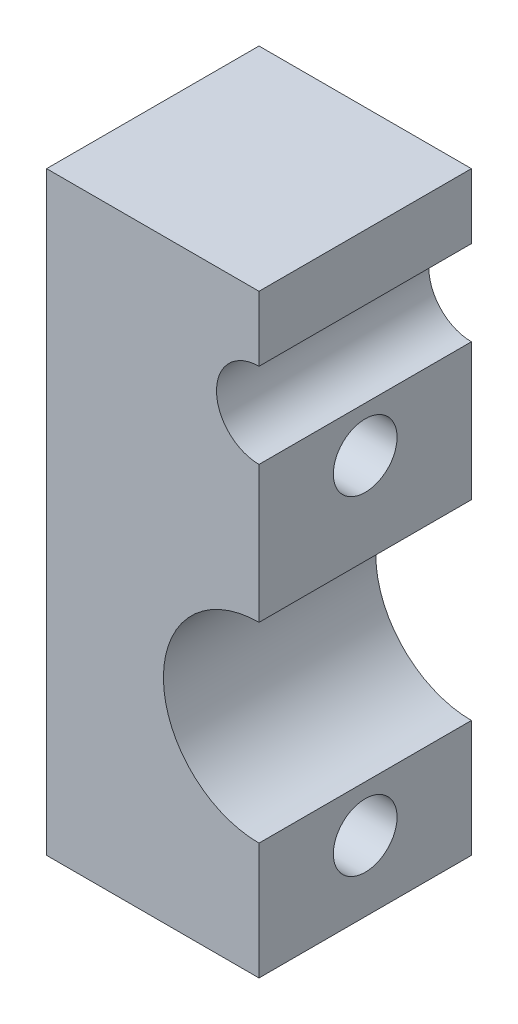
ISO-10303-21;
HEADER;
FILE_DESCRIPTION(('STEP AP214'),'2;1');
FILE_NAME('part.step','',(''),(''),'','','');
FILE_SCHEMA(('AUTOMOTIVE_DESIGN { 1 0 10303 214 1 1 1 1 }'));
ENDSEC;
DATA;
#1=APPLICATION_CONTEXT('core data for automotive mechanical design processes');
#2=APPLICATION_PROTOCOL_DEFINITION('international standard','automotive_design',2000,#1);
#3=PRODUCT_CONTEXT('',#1,'mechanical');
#4=PRODUCT('Part','Part','',(#3));
#5=PRODUCT_RELATED_PRODUCT_CATEGORY('part','',(#4));
#6=PRODUCT_DEFINITION_FORMATION('','',#4);
#7=PRODUCT_DEFINITION_CONTEXT('part definition',#1,'design');
#8=PRODUCT_DEFINITION('design','',#6,#7);
#9=PRODUCT_DEFINITION_SHAPE('','',#8);
#10=(LENGTH_UNIT() NAMED_UNIT(*) SI_UNIT(.MILLI.,.METRE.));
#11=(NAMED_UNIT(*) PLANE_ANGLE_UNIT() SI_UNIT($,.RADIAN.));
#12=(NAMED_UNIT(*) SI_UNIT($,.STERADIAN.) SOLID_ANGLE_UNIT());
#13=UNCERTAINTY_MEASURE_WITH_UNIT(LENGTH_MEASURE(1.E-05),#10,'distance_accuracy_value','');
#14=(GEOMETRIC_REPRESENTATION_CONTEXT(3) GLOBAL_UNCERTAINTY_ASSIGNED_CONTEXT((#13)) GLOBAL_UNIT_ASSIGNED_CONTEXT((#10,
#11,#12)) REPRESENTATION_CONTEXT('',''));
#15=CARTESIAN_POINT('',(0.,0.,0.));
#16=DIRECTION('',(0.,0.,1.));
#17=DIRECTION('',(1.,0.,0.));
#18=AXIS2_PLACEMENT_3D('',#15,#16,#17);
#19=CARTESIAN_POINT('',(5.,28.,-5.));
#20=DIRECTION('',(-1.,0.,0.));
#21=DIRECTION('',(0.,0.,1.));
#22=AXIS2_PLACEMENT_3D('',#19,#20,#21);
#23=PLANE('',#22);
#24=CARTESIAN_POINT('',(5.,18.7988960078297,0.));
#25=DIRECTION('',(1.,0.,0.));
#26=DIRECTION('',(0.,0.,-1.));
#27=AXIS2_PLACEMENT_3D('',#24,#25,#26);
#28=CIRCLE('',#27,1.5);
#29=CARTESIAN_POINT('',(5.,18.7988960078297,-1.5));
#30=VERTEX_POINT('',#29);
#31=EDGE_CURVE('E171',#30,#30,#28,.T.);
#32=ORIENTED_EDGE('',*,*,#31,.F.);
#33=EDGE_LOOP('',(#32));
#34=FACE_BOUND('',#33,.T.);
#35=DIRECTION('',(0.,-1.,0.));
#36=VECTOR('',#35,1.);
#37=CARTESIAN_POINT('',(5.,28.,-5.));
#38=LINE('',#37,#36);
#39=CARTESIAN_POINT('',(5.,20.9406561714239,-5.));
#40=VERTEX_POINT('',#39);
#41=CARTESIAN_POINT('',(5.,14.4999999964587,-5.));
#42=VERTEX_POINT('',#41);
#43=EDGE_CURVE('E41',#40,#42,#38,.T.);
#44=ORIENTED_EDGE('',*,*,#43,.F.);
#45=DIRECTION('',(0.,0.,1.));
#46=VECTOR('',#45,1.);
#47=CARTESIAN_POINT('',(5.,20.9406561714239,-5.));
#48=LINE('',#47,#46);
#49=CARTESIAN_POINT('',(5.,20.9406561714239,5.));
#50=VERTEX_POINT('',#49);
#51=EDGE_CURVE('E101',#40,#50,#48,.T.);
#52=ORIENTED_EDGE('',*,*,#51,.T.);
#53=DIRECTION('',(0.,-1.,0.));
#54=VECTOR('',#53,1.);
#55=CARTESIAN_POINT('',(5.,28.,5.));
#56=LINE('',#55,#54);
#57=CARTESIAN_POINT('',(5.,14.4999999964587,5.));
#58=VERTEX_POINT('',#57);
#59=EDGE_CURVE('E57',#50,#58,#56,.T.);
#60=ORIENTED_EDGE('',*,*,#59,.T.);
#61=DIRECTION('',(0.,0.,1.));
#62=VECTOR('',#61,1.);
#63=CARTESIAN_POINT('',(5.,14.4999999964587,-5.));
#64=LINE('',#63,#62);
#65=EDGE_CURVE('E157',#58,#42,#64,.F.);
#66=ORIENTED_EDGE('',*,*,#65,.T.);
#67=EDGE_LOOP('',(#44,#52,#60,#66));
#68=FACE_BOUND('',#67,.T.);
#69=ADVANCED_FACE('F33',(#34,#68),#23,.F.);
#70=CARTESIAN_POINT('',(5.,3.30969720228325,0.));
#71=DIRECTION('',(1.,0.,0.));
#72=DIRECTION('',(0.,0.,-1.));
#73=AXIS2_PLACEMENT_3D('',#70,#71,#72);
#74=CIRCLE('',#73,1.5);
#75=CARTESIAN_POINT('',(5.,3.30969720228325,-1.5));
#76=VERTEX_POINT('',#75);
#77=EDGE_CURVE('E165',#76,#76,#74,.T.);
#78=ORIENTED_EDGE('',*,*,#77,.F.);
#79=EDGE_LOOP('',(#78));
#80=FACE_BOUND('',#79,.T.);
#81=CARTESIAN_POINT('',(5.,5.50000000575559,-5.));
#82=VERTEX_POINT('',#81);
#83=CARTESIAN_POINT('',(5.,0.,-5.));
#84=VERTEX_POINT('',#83);
#85=EDGE_CURVE('E42',#82,#84,#38,.T.);
#86=ORIENTED_EDGE('',*,*,#85,.F.);
#87=DIRECTION('',(0.,0.,1.));
#88=VECTOR('',#87,1.);
#89=CARTESIAN_POINT('',(5.,5.50000000575559,-5.));
#90=LINE('',#89,#88);
#91=CARTESIAN_POINT('',(5.,5.50000000575559,5.));
#92=VERTEX_POINT('',#91);
#93=EDGE_CURVE('E133',#82,#92,#90,.T.);
#94=ORIENTED_EDGE('',*,*,#93,.T.);
#95=CARTESIAN_POINT('',(5.,0.,5.));
#96=VERTEX_POINT('',#95);
#97=EDGE_CURVE('E138',#92,#96,#56,.T.);
#98=ORIENTED_EDGE('',*,*,#97,.T.);
#99=DIRECTION('',(0.,0.,-1.));
#100=VECTOR('',#99,1.);
#101=CARTESIAN_POINT('',(5.,0.,-5.));
#102=LINE('',#101,#100);
#103=EDGE_CURVE('E139',#96,#84,#102,.T.);
#104=ORIENTED_EDGE('',*,*,#103,.T.);
#105=EDGE_LOOP('',(#86,#94,#98,#104));
#106=FACE_BOUND('',#105,.T.);
#107=ADVANCED_FACE('F181',(#80,#106),#23,.F.);
#108=CARTESIAN_POINT('',(5.,28.,5.));
#109=VERTEX_POINT('',#108);
#110=CARTESIAN_POINT('',(5.,24.9406561595513,5.));
#111=VERTEX_POINT('',#110);
#112=EDGE_CURVE('E111',#109,#111,#56,.T.);
#113=ORIENTED_EDGE('',*,*,#112,.T.);
#114=DIRECTION('',(0.,0.,1.));
#115=VECTOR('',#114,1.);
#116=CARTESIAN_POINT('',(5.,24.9406561595513,-5.));
#117=LINE('',#116,#115);
#118=CARTESIAN_POINT('',(5.,24.9406561595513,-5.));
#119=VERTEX_POINT('',#118);
#120=EDGE_CURVE('E49',#111,#119,#117,.F.);
#121=ORIENTED_EDGE('',*,*,#120,.T.);
#122=CARTESIAN_POINT('',(5.,28.,-5.));
#123=VERTEX_POINT('',#122);
#124=EDGE_CURVE('E11',#123,#119,#38,.T.);
#125=ORIENTED_EDGE('',*,*,#124,.F.);
#126=DIRECTION('',(0.,0.,-1.));
#127=VECTOR('',#126,1.);
#128=CARTESIAN_POINT('',(5.,28.,-5.));
#129=LINE('',#128,#127);
#130=EDGE_CURVE('E122',#109,#123,#129,.T.);
#131=ORIENTED_EDGE('',*,*,#130,.F.);
#132=EDGE_LOOP('',(#113,#121,#125,#131));
#133=FACE_BOUND('',#132,.T.);
#134=ADVANCED_FACE('F35',(#133),#23,.F.);
#135=CARTESIAN_POINT('',(-5.,28.,-5.));
#136=DIRECTION('',(0.,0.,1.));
#137=DIRECTION('',(1.,0.,0.));
#138=AXIS2_PLACEMENT_3D('',#135,#136,#137);
#139=PLANE('',#138);
#140=ORIENTED_EDGE('',*,*,#124,.T.);
#141=CARTESIAN_POINT('',(4.99999997133255,22.9406561654876,-5.));
#142=DIRECTION('',(0.,0.,1.));
#143=DIRECTION('',(1.,0.,0.));
#144=AXIS2_PLACEMENT_3D('',#141,#142,#143);
#145=CIRCLE('',#144,1.9999999940637);
#146=EDGE_CURVE('E99',#119,#40,#145,.T.);
#147=ORIENTED_EDGE('',*,*,#146,.T.);
#148=ORIENTED_EDGE('',*,*,#43,.T.);
#149=CARTESIAN_POINT('',(5.00000000486087,10.0000000011071,-5.));
#150=DIRECTION('',(0.,0.,1.));
#151=DIRECTION('',(1.,0.,0.));
#152=AXIS2_PLACEMENT_3D('',#149,#150,#151);
#153=CIRCLE('',#152,4.49999999535153);
#154=EDGE_CURVE('E154',#42,#82,#153,.T.);
#155=ORIENTED_EDGE('',*,*,#154,.T.);
#156=ORIENTED_EDGE('',*,*,#85,.T.);
#157=DIRECTION('',(-1.,0.,0.));
#158=VECTOR('',#157,1.);
#159=CARTESIAN_POINT('',(-5.,0.,-5.));
#160=LINE('',#159,#158);
#161=CARTESIAN_POINT('',(-5.,0.,-5.));
#162=VERTEX_POINT('',#161);
#163=EDGE_CURVE('E142',#84,#162,#160,.T.);
#164=ORIENTED_EDGE('',*,*,#163,.T.);
#165=DIRECTION('',(0.,-1.,0.));
#166=VECTOR('',#165,1.);
#167=CARTESIAN_POINT('',(-5.,28.,-5.));
#168=LINE('',#167,#166);
#169=CARTESIAN_POINT('',(-5.,28.,-5.));
#170=VERTEX_POINT('',#169);
#171=EDGE_CURVE('E118',#170,#162,#168,.T.);
#172=ORIENTED_EDGE('',*,*,#171,.F.);
#173=DIRECTION('',(-1.,0.,0.));
#174=VECTOR('',#173,1.);
#175=CARTESIAN_POINT('',(-5.,28.,-5.));
#176=LINE('',#175,#174);
#177=EDGE_CURVE('E115',#123,#170,#176,.T.);
#178=ORIENTED_EDGE('',*,*,#177,.F.);
#179=EDGE_LOOP('',(#140,#147,#148,#155,#156,#164,#172,#178));
#180=FACE_BOUND('',#179,.T.);
#181=ADVANCED_FACE('F113',(#180),#139,.F.);
#182=CARTESIAN_POINT('',(-5.,28.,-5.));
#183=DIRECTION('',(1.,0.,0.));
#184=DIRECTION('',(0.,0.,-1.));
#185=AXIS2_PLACEMENT_3D('',#182,#183,#184);
#186=PLANE('',#185);
#187=CARTESIAN_POINT('',(-5.,18.7988960078297,0.));
#188=DIRECTION('',(1.,0.,0.));
#189=DIRECTION('',(0.,0.,-1.));
#190=AXIS2_PLACEMENT_3D('',#187,#188,#189);
#191=CIRCLE('',#190,1.5);
#192=CARTESIAN_POINT('',(-5.,18.7988960078297,-1.5));
#193=VERTEX_POINT('',#192);
#194=EDGE_CURVE('E168',#193,#193,#191,.T.);
#195=ORIENTED_EDGE('',*,*,#194,.T.);
#196=EDGE_LOOP('',(#195));
#197=FACE_BOUND('',#196,.T.);
#198=CARTESIAN_POINT('',(-5.,3.30969720228325,0.));
#199=DIRECTION('',(1.,0.,0.));
#200=DIRECTION('',(0.,0.,-1.));
#201=AXIS2_PLACEMENT_3D('',#198,#199,#200);
#202=CIRCLE('',#201,1.5);
#203=CARTESIAN_POINT('',(-5.,3.30969720228325,-1.5));
#204=VERTEX_POINT('',#203);
#205=EDGE_CURVE('E163',#204,#204,#202,.T.);
#206=ORIENTED_EDGE('',*,*,#205,.T.);
#207=EDGE_LOOP('',(#206));
#208=FACE_BOUND('',#207,.T.);
#209=DIRECTION('',(0.,0.,1.));
#210=VECTOR('',#209,1.);
#211=CARTESIAN_POINT('',(-5.,0.,-5.));
#212=LINE('',#211,#210);
#213=CARTESIAN_POINT('',(-5.,0.,5.));
#214=VERTEX_POINT('',#213);
#215=EDGE_CURVE('E130',#162,#214,#212,.T.);
#216=ORIENTED_EDGE('',*,*,#215,.T.);
#217=DIRECTION('',(0.,-1.,0.));
#218=VECTOR('',#217,1.);
#219=CARTESIAN_POINT('',(-5.,28.,5.));
#220=LINE('',#219,#218);
#221=CARTESIAN_POINT('',(-5.,28.,5.));
#222=VERTEX_POINT('',#221);
#223=EDGE_CURVE('E146',#222,#214,#220,.T.);
#224=ORIENTED_EDGE('',*,*,#223,.F.);
#225=DIRECTION('',(0.,0.,1.));
#226=VECTOR('',#225,1.);
#227=CARTESIAN_POINT('',(-5.,28.,-5.));
#228=LINE('',#227,#226);
#229=EDGE_CURVE('E121',#170,#222,#228,.T.);
#230=ORIENTED_EDGE('',*,*,#229,.F.);
#231=ORIENTED_EDGE('',*,*,#171,.T.);
#232=EDGE_LOOP('',(#216,#224,#230,#231));
#233=FACE_BOUND('',#232,.T.);
#234=ADVANCED_FACE('F187',(#197,#208,#233),#186,.F.);
#235=CARTESIAN_POINT('',(-5.,28.,5.));
#236=DIRECTION('',(0.,0.,-1.));
#237=DIRECTION('',(-1.,0.,0.));
#238=AXIS2_PLACEMENT_3D('',#235,#236,#237);
#239=PLANE('',#238);
#240=ORIENTED_EDGE('',*,*,#59,.F.);
#241=CARTESIAN_POINT('',(4.99999997133255,22.9406561654876,5.));
#242=DIRECTION('',(0.,0.,1.));
#243=DIRECTION('',(1.,0.,0.));
#244=AXIS2_PLACEMENT_3D('',#241,#242,#243);
#245=CIRCLE('',#244,1.9999999940637);
#246=EDGE_CURVE('E104',#111,#50,#245,.T.);
#247=ORIENTED_EDGE('',*,*,#246,.F.);
#248=ORIENTED_EDGE('',*,*,#112,.F.);
#249=DIRECTION('',(1.,0.,0.));
#250=VECTOR('',#249,1.);
#251=CARTESIAN_POINT('',(-5.,28.,5.));
#252=LINE('',#251,#250);
#253=EDGE_CURVE('E126',#222,#109,#252,.T.);
#254=ORIENTED_EDGE('',*,*,#253,.F.);
#255=ORIENTED_EDGE('',*,*,#223,.T.);
#256=DIRECTION('',(1.,0.,0.));
#257=VECTOR('',#256,1.);
#258=CARTESIAN_POINT('',(-5.,0.,5.));
#259=LINE('',#258,#257);
#260=EDGE_CURVE('E127',#214,#96,#259,.T.);
#261=ORIENTED_EDGE('',*,*,#260,.T.);
#262=ORIENTED_EDGE('',*,*,#97,.F.);
#263=CARTESIAN_POINT('',(5.00000000486087,10.0000000011071,5.));
#264=DIRECTION('',(0.,0.,1.));
#265=DIRECTION('',(1.,0.,0.));
#266=AXIS2_PLACEMENT_3D('',#263,#264,#265);
#267=CIRCLE('',#266,4.49999999535153);
#268=EDGE_CURVE('E160',#58,#92,#267,.T.);
#269=ORIENTED_EDGE('',*,*,#268,.F.);
#270=EDGE_LOOP('',(#240,#247,#248,#254,#255,#261,#262,#269));
#271=FACE_BOUND('',#270,.T.);
#272=ADVANCED_FACE('F178',(#271),#239,.F.);
#273=CARTESIAN_POINT('',(5.,28.,5.));
#274=DIRECTION('',(0.,1.,0.));
#275=DIRECTION('',(0.,0.,1.));
#276=AXIS2_PLACEMENT_3D('',#273,#274,#275);
#277=PLANE('',#276);
#278=ORIENTED_EDGE('',*,*,#130,.T.);
#279=ORIENTED_EDGE('',*,*,#177,.T.);
#280=ORIENTED_EDGE('',*,*,#229,.T.);
#281=ORIENTED_EDGE('',*,*,#253,.T.);
#282=EDGE_LOOP('',(#278,#279,#280,#281));
#283=FACE_BOUND('',#282,.T.);
#284=ADVANCED_FACE('F124',(#283),#277,.T.);
#285=CARTESIAN_POINT('',(5.,0.,5.));
#286=DIRECTION('',(0.,1.,0.));
#287=DIRECTION('',(0.,0.,1.));
#288=AXIS2_PLACEMENT_3D('',#285,#286,#287);
#289=PLANE('',#288);
#290=ORIENTED_EDGE('',*,*,#103,.F.);
#291=ORIENTED_EDGE('',*,*,#260,.F.);
#292=ORIENTED_EDGE('',*,*,#215,.F.);
#293=ORIENTED_EDGE('',*,*,#163,.F.);
#294=EDGE_LOOP('',(#290,#291,#292,#293));
#295=FACE_BOUND('',#294,.T.);
#296=ADVANCED_FACE('F186',(#295),#289,.F.);
#297=CARTESIAN_POINT('',(5.00000000486087,10.0000000011071,-5.));
#298=DIRECTION('',(0.,0.,1.));
#299=DIRECTION('',(1.,0.,0.));
#300=AXIS2_PLACEMENT_3D('',#297,#298,#299);
#301=CYLINDRICAL_SURFACE('',#300,4.49999999535153);
#302=ORIENTED_EDGE('',*,*,#154,.F.);
#303=ORIENTED_EDGE('',*,*,#65,.F.);
#304=ORIENTED_EDGE('',*,*,#268,.T.);
#305=ORIENTED_EDGE('',*,*,#93,.F.);
#306=EDGE_LOOP('',(#302,#303,#304,#305));
#307=FACE_BOUND('',#306,.T.);
#308=ADVANCED_FACE('F156',(#307),#301,.F.);
#309=CARTESIAN_POINT('',(-5.,3.30969720228325,0.));
#310=DIRECTION('',(1.,0.,0.));
#311=DIRECTION('',(0.,0.,-1.));
#312=AXIS2_PLACEMENT_3D('',#309,#310,#311);
#313=CYLINDRICAL_SURFACE('',#312,1.5);
#314=CARTESIAN_POINT('',(-5.,3.30969720228325,-1.5));
#315=CARTESIAN_POINT('',(-4.89583333333334,3.30969720228325,-1.5));
#316=CARTESIAN_POINT('',(-4.79166666666667,3.30969720228325,-1.5));
#317=CARTESIAN_POINT('',(-4.58333333333334,3.30969720228325,-1.5));
#318=CARTESIAN_POINT('',(-4.47916666666667,3.30969720228325,-1.5));
#319=CARTESIAN_POINT('',(-4.27083333333334,3.30969720228325,-1.5));
#320=CARTESIAN_POINT('',(-4.16666666666667,3.30969720228325,-1.5));
#321=CARTESIAN_POINT('',(-3.95833333333334,3.30969720228325,-1.5));
#322=CARTESIAN_POINT('',(-3.85416666666667,3.30969720228325,-1.5));
#323=CARTESIAN_POINT('',(-3.64583333333334,3.30969720228325,-1.5));
#324=CARTESIAN_POINT('',(-3.54166666666667,3.30969720228325,-1.5));
#325=CARTESIAN_POINT('',(-3.33333333333334,3.30969720228325,-1.5));
#326=CARTESIAN_POINT('',(-3.22916666666667,3.30969720228325,-1.5));
#327=CARTESIAN_POINT('',(-3.02083333333334,3.30969720228325,-1.5));
#328=CARTESIAN_POINT('',(-2.91666666666667,3.30969720228325,-1.5));
#329=CARTESIAN_POINT('',(-2.70833333333334,3.30969720228325,-1.5));
#330=CARTESIAN_POINT('',(-2.60416666666667,3.30969720228325,-1.5));
#331=CARTESIAN_POINT('',(-2.39583333333334,3.30969720228325,-1.5));
#332=CARTESIAN_POINT('',(-2.29166666666667,3.30969720228325,-1.5));
#333=CARTESIAN_POINT('',(-2.08333333333334,3.30969720228325,-1.5));
#334=CARTESIAN_POINT('',(-1.97916666666667,3.30969720228325,-1.5));
#335=CARTESIAN_POINT('',(-1.77083333333334,3.30969720228325,-1.5));
#336=CARTESIAN_POINT('',(-1.66666666666667,3.30969720228325,-1.5));
#337=CARTESIAN_POINT('',(-1.45833333333334,3.30969720228325,-1.5));
#338=CARTESIAN_POINT('',(-1.35416666666667,3.30969720228325,-1.5));
#339=CARTESIAN_POINT('',(-1.14583333333334,3.30969720228325,-1.5));
#340=CARTESIAN_POINT('',(-1.04166666666667,3.30969720228325,-1.5));
#341=CARTESIAN_POINT('',(-0.833333333333336,3.30969720228325,-1.5));
#342=CARTESIAN_POINT('',(-0.729166666666669,3.30969720228325,-1.5));
#343=CARTESIAN_POINT('',(-0.520833333333335,3.30969720228325,-1.5));
#344=CARTESIAN_POINT('',(-0.416666666666669,3.30969720228325,-1.5));
#345=CARTESIAN_POINT('',(-0.208333333333335,3.30969720228325,-1.5));
#346=CARTESIAN_POINT('',(-0.104166666666668,3.30969720228325,-1.5));
#347=CARTESIAN_POINT('',(0.104166666666665,3.30969720228325,-1.5));
#348=CARTESIAN_POINT('',(0.208333333333332,3.30969720228325,-1.5));
#349=CARTESIAN_POINT('',(0.416666666666665,3.30969720228325,-1.5));
#350=CARTESIAN_POINT('',(0.520833333333332,3.30969720228325,-1.5));
#351=CARTESIAN_POINT('',(0.729166666666666,3.30969720228325,-1.5));
#352=CARTESIAN_POINT('',(0.833333333333332,3.30969720228325,-1.5));
#353=CARTESIAN_POINT('',(1.04166666666667,3.30969720228325,-1.5));
#354=CARTESIAN_POINT('',(1.14583333333333,3.30969720228325,-1.5));
#355=CARTESIAN_POINT('',(1.35416666666667,3.30969720228325,-1.5));
#356=CARTESIAN_POINT('',(1.45833333333333,3.30969720228325,-1.5));
#357=CARTESIAN_POINT('',(1.66666666666667,3.30969720228325,-1.5));
#358=CARTESIAN_POINT('',(1.77083333333333,3.30969720228325,-1.5));
#359=CARTESIAN_POINT('',(1.97916666666667,3.30969720228325,-1.5));
#360=CARTESIAN_POINT('',(2.08333333333333,3.30969720228325,-1.5));
#361=CARTESIAN_POINT('',(2.29166666666667,3.30969720228325,-1.5));
#362=CARTESIAN_POINT('',(2.39583333333333,3.30969720228325,-1.5));
#363=CARTESIAN_POINT('',(2.60416666666667,3.30969720228325,-1.5));
#364=CARTESIAN_POINT('',(2.70833333333333,3.30969720228325,-1.5));
#365=CARTESIAN_POINT('',(2.91666666666667,3.30969720228325,-1.5));
#366=CARTESIAN_POINT('',(3.02083333333333,3.30969720228325,-1.5));
#367=CARTESIAN_POINT('',(3.22916666666667,3.30969720228325,-1.5));
#368=CARTESIAN_POINT('',(3.33333333333333,3.30969720228325,-1.5));
#369=CARTESIAN_POINT('',(3.54166666666667,3.30969720228325,-1.5));
#370=CARTESIAN_POINT('',(3.64583333333333,3.30969720228325,-1.5));
#371=CARTESIAN_POINT('',(3.85416666666667,3.30969720228325,-1.5));
#372=CARTESIAN_POINT('',(3.95833333333333,3.30969720228325,-1.5));
#373=CARTESIAN_POINT('',(4.16666666666667,3.30969720228325,-1.5));
#374=CARTESIAN_POINT('',(4.27083333333333,3.30969720228325,-1.5));
#375=CARTESIAN_POINT('',(4.47916666666667,3.30969720228325,-1.5));
#376=CARTESIAN_POINT('',(4.58333333333333,3.30969720228325,-1.5));
#377=CARTESIAN_POINT('',(4.79166666666667,3.30969720228325,-1.5));
#378=CARTESIAN_POINT('',(4.89583333333333,3.30969720228325,-1.5));
#379=CARTESIAN_POINT('',(5.,3.30969720228325,-1.5));
#380=B_SPLINE_CURVE_WITH_KNOTS('',3,(#314,#315,#316,#317,#318,#319,#320,#321,#322,#323,#324,
#325,#326,#327,#328,#329,#330,#331,#332,#333,#334,#335,#336,#337,#338,#339,#340,#341,#342,#343,
#344,#345,#346,#347,#348,#349,#350,#351,#352,#353,#354,#355,#356,#357,#358,#359,#360,#361,#362,
#363,#364,#365,#366,#367,#368,#369,#370,#371,#372,#373,#374,#375,#376,#377,#378,#379),
.UNSPECIFIED.,.F.,.F.,(4,2,2,2,2,2,2,2,2,2,2,2,2,2,2,2,2,2,2,2,2,2,2,2,2,2,2,2,2,2,2,2,4),(0.,
0.3125,0.625000000000001,0.937500000000001,1.25,1.5625,1.875,2.1875,2.5,2.8125,3.125,3.4375,
3.75,4.0625,4.375,4.6875,5.,5.3125,5.625,5.9375,6.25,6.5625,6.875,7.1875,7.5,7.8125,8.125,
8.4375,8.75,9.06250000000001,9.37500000000001,9.68750000000001,10.),.UNSPECIFIED.);
#381=EDGE_CURVE('BSEAM240',#204,#76,#380,.T.);
#382=ORIENTED_EDGE('',*,*,#205,.F.);
#383=ORIENTED_EDGE('',*,*,#77,.T.);
#384=ORIENTED_EDGE('',*,*,#381,.T.);
#385=ORIENTED_EDGE('',*,*,#381,.F.);
#386=EDGE_LOOP('',(#382,#384,#383,#385));
#387=FACE_BOUND('',#386,.T.);
#388=ADVANCED_FACE('F240',(#387),#313,.F.);
#389=CARTESIAN_POINT('',(-5.,18.7988960078297,0.));
#390=DIRECTION('',(1.,0.,0.));
#391=DIRECTION('',(0.,0.,-1.));
#392=AXIS2_PLACEMENT_3D('',#389,#390,#391);
#393=CYLINDRICAL_SURFACE('',#392,1.5);
#394=CARTESIAN_POINT('',(-5.,18.7988960078297,-1.5));
#395=CARTESIAN_POINT('',(-4.89583333333334,18.7988960078297,-1.5));
#396=CARTESIAN_POINT('',(-4.79166666666667,18.7988960078297,-1.5));
#397=CARTESIAN_POINT('',(-4.58333333333334,18.7988960078297,-1.5));
#398=CARTESIAN_POINT('',(-4.47916666666667,18.7988960078297,-1.5));
#399=CARTESIAN_POINT('',(-4.27083333333334,18.7988960078297,-1.5));
#400=CARTESIAN_POINT('',(-4.16666666666667,18.7988960078297,-1.5));
#401=CARTESIAN_POINT('',(-3.95833333333334,18.7988960078297,-1.5));
#402=CARTESIAN_POINT('',(-3.85416666666667,18.7988960078297,-1.5));
#403=CARTESIAN_POINT('',(-3.64583333333334,18.7988960078297,-1.5));
#404=CARTESIAN_POINT('',(-3.54166666666667,18.7988960078297,-1.5));
#405=CARTESIAN_POINT('',(-3.33333333333334,18.7988960078297,-1.5));
#406=CARTESIAN_POINT('',(-3.22916666666667,18.7988960078297,-1.5));
#407=CARTESIAN_POINT('',(-3.02083333333334,18.7988960078297,-1.5));
#408=CARTESIAN_POINT('',(-2.91666666666667,18.7988960078297,-1.5));
#409=CARTESIAN_POINT('',(-2.70833333333334,18.7988960078297,-1.5));
#410=CARTESIAN_POINT('',(-2.60416666666667,18.7988960078297,-1.5));
#411=CARTESIAN_POINT('',(-2.39583333333334,18.7988960078297,-1.5));
#412=CARTESIAN_POINT('',(-2.29166666666667,18.7988960078297,-1.5));
#413=CARTESIAN_POINT('',(-2.08333333333334,18.7988960078297,-1.5));
#414=CARTESIAN_POINT('',(-1.97916666666667,18.7988960078297,-1.5));
#415=CARTESIAN_POINT('',(-1.77083333333334,18.7988960078297,-1.5));
#416=CARTESIAN_POINT('',(-1.66666666666667,18.7988960078297,-1.5));
#417=CARTESIAN_POINT('',(-1.45833333333334,18.7988960078297,-1.5));
#418=CARTESIAN_POINT('',(-1.35416666666667,18.7988960078297,-1.5));
#419=CARTESIAN_POINT('',(-1.14583333333334,18.7988960078297,-1.5));
#420=CARTESIAN_POINT('',(-1.04166666666667,18.7988960078297,-1.5));
#421=CARTESIAN_POINT('',(-0.833333333333336,18.7988960078297,-1.5));
#422=CARTESIAN_POINT('',(-0.729166666666669,18.7988960078297,-1.5));
#423=CARTESIAN_POINT('',(-0.520833333333335,18.7988960078297,-1.5));
#424=CARTESIAN_POINT('',(-0.416666666666669,18.7988960078297,-1.5));
#425=CARTESIAN_POINT('',(-0.208333333333335,18.7988960078297,-1.5));
#426=CARTESIAN_POINT('',(-0.104166666666668,18.7988960078297,-1.5));
#427=CARTESIAN_POINT('',(0.104166666666665,18.7988960078297,-1.5));
#428=CARTESIAN_POINT('',(0.208333333333332,18.7988960078297,-1.5));
#429=CARTESIAN_POINT('',(0.416666666666665,18.7988960078297,-1.5));
#430=CARTESIAN_POINT('',(0.520833333333332,18.7988960078297,-1.5));
#431=CARTESIAN_POINT('',(0.729166666666666,18.7988960078297,-1.5));
#432=CARTESIAN_POINT('',(0.833333333333332,18.7988960078297,-1.5));
#433=CARTESIAN_POINT('',(1.04166666666667,18.7988960078297,-1.5));
#434=CARTESIAN_POINT('',(1.14583333333333,18.7988960078297,-1.5));
#435=CARTESIAN_POINT('',(1.35416666666667,18.7988960078297,-1.5));
#436=CARTESIAN_POINT('',(1.45833333333333,18.7988960078297,-1.5));
#437=CARTESIAN_POINT('',(1.66666666666667,18.7988960078297,-1.5));
#438=CARTESIAN_POINT('',(1.77083333333333,18.7988960078297,-1.5));
#439=CARTESIAN_POINT('',(1.97916666666667,18.7988960078297,-1.5));
#440=CARTESIAN_POINT('',(2.08333333333333,18.7988960078297,-1.5));
#441=CARTESIAN_POINT('',(2.29166666666667,18.7988960078297,-1.5));
#442=CARTESIAN_POINT('',(2.39583333333333,18.7988960078297,-1.5));
#443=CARTESIAN_POINT('',(2.60416666666667,18.7988960078297,-1.5));
#444=CARTESIAN_POINT('',(2.70833333333333,18.7988960078297,-1.5));
#445=CARTESIAN_POINT('',(2.91666666666667,18.7988960078297,-1.5));
#446=CARTESIAN_POINT('',(3.02083333333333,18.7988960078297,-1.5));
#447=CARTESIAN_POINT('',(3.22916666666667,18.7988960078297,-1.5));
#448=CARTESIAN_POINT('',(3.33333333333333,18.7988960078297,-1.5));
#449=CARTESIAN_POINT('',(3.54166666666667,18.7988960078297,-1.5));
#450=CARTESIAN_POINT('',(3.64583333333333,18.7988960078297,-1.5));
#451=CARTESIAN_POINT('',(3.85416666666667,18.7988960078297,-1.5));
#452=CARTESIAN_POINT('',(3.95833333333333,18.7988960078297,-1.5));
#453=CARTESIAN_POINT('',(4.16666666666667,18.7988960078297,-1.5));
#454=CARTESIAN_POINT('',(4.27083333333333,18.7988960078297,-1.5));
#455=CARTESIAN_POINT('',(4.47916666666667,18.7988960078297,-1.5));
#456=CARTESIAN_POINT('',(4.58333333333333,18.7988960078297,-1.5));
#457=CARTESIAN_POINT('',(4.79166666666667,18.7988960078297,-1.5));
#458=CARTESIAN_POINT('',(4.89583333333333,18.7988960078297,-1.5));
#459=CARTESIAN_POINT('',(5.,18.7988960078297,-1.5));
#460=B_SPLINE_CURVE_WITH_KNOTS('',3,(#394,#395,#396,#397,#398,#399,#400,#401,#402,#403,#404,
#405,#406,#407,#408,#409,#410,#411,#412,#413,#414,#415,#416,#417,#418,#419,#420,#421,#422,#423,
#424,#425,#426,#427,#428,#429,#430,#431,#432,#433,#434,#435,#436,#437,#438,#439,#440,#441,#442,
#443,#444,#445,#446,#447,#448,#449,#450,#451,#452,#453,#454,#455,#456,#457,#458,#459),
.UNSPECIFIED.,.F.,.F.,(4,2,2,2,2,2,2,2,2,2,2,2,2,2,2,2,2,2,2,2,2,2,2,2,2,2,2,2,2,2,2,2,4),(0.,
0.3125,0.625000000000001,0.937500000000001,1.25,1.5625,1.875,2.1875,2.5,2.8125,3.125,3.4375,
3.75,4.0625,4.375,4.6875,5.,5.3125,5.625,5.9375,6.25,6.5625,6.875,7.1875,7.5,7.8125,8.125,
8.4375,8.75,9.06250000000001,9.37500000000001,9.68750000000001,10.),.UNSPECIFIED.);
#461=EDGE_CURVE('BSEAM230',#193,#30,#460,.T.);
#462=ORIENTED_EDGE('',*,*,#194,.F.);
#463=ORIENTED_EDGE('',*,*,#31,.T.);
#464=ORIENTED_EDGE('',*,*,#461,.T.);
#465=ORIENTED_EDGE('',*,*,#461,.F.);
#466=EDGE_LOOP('',(#462,#464,#463,#465));
#467=FACE_BOUND('',#466,.T.);
#468=ADVANCED_FACE('F230',(#467),#393,.F.);
#469=CARTESIAN_POINT('',(4.99999997133255,22.9406561654876,-5.));
#470=DIRECTION('',(0.,0.,1.));
#471=DIRECTION('',(1.,0.,0.));
#472=AXIS2_PLACEMENT_3D('',#469,#470,#471);
#473=CYLINDRICAL_SURFACE('',#472,1.9999999940637);
#474=ORIENTED_EDGE('',*,*,#146,.F.);
#475=ORIENTED_EDGE('',*,*,#120,.F.);
#476=ORIENTED_EDGE('',*,*,#246,.T.);
#477=ORIENTED_EDGE('',*,*,#51,.F.);
#478=EDGE_LOOP('',(#474,#475,#476,#477));
#479=FACE_BOUND('',#478,.T.);
#480=ADVANCED_FACE('F100',(#479),#473,.F.);
#481=CLOSED_SHELL('',(#69,#107,#134,#181,#234,#272,#284,#296,#308,#388,#468,#480));
#482=MANIFOLD_SOLID_BREP('B2',#481);
#483=ADVANCED_BREP_SHAPE_REPRESENTATION('',(#18,#482),#14);
#484=SHAPE_DEFINITION_REPRESENTATION(#9,#483);
ENDSEC;
END-ISO-10303-21;
